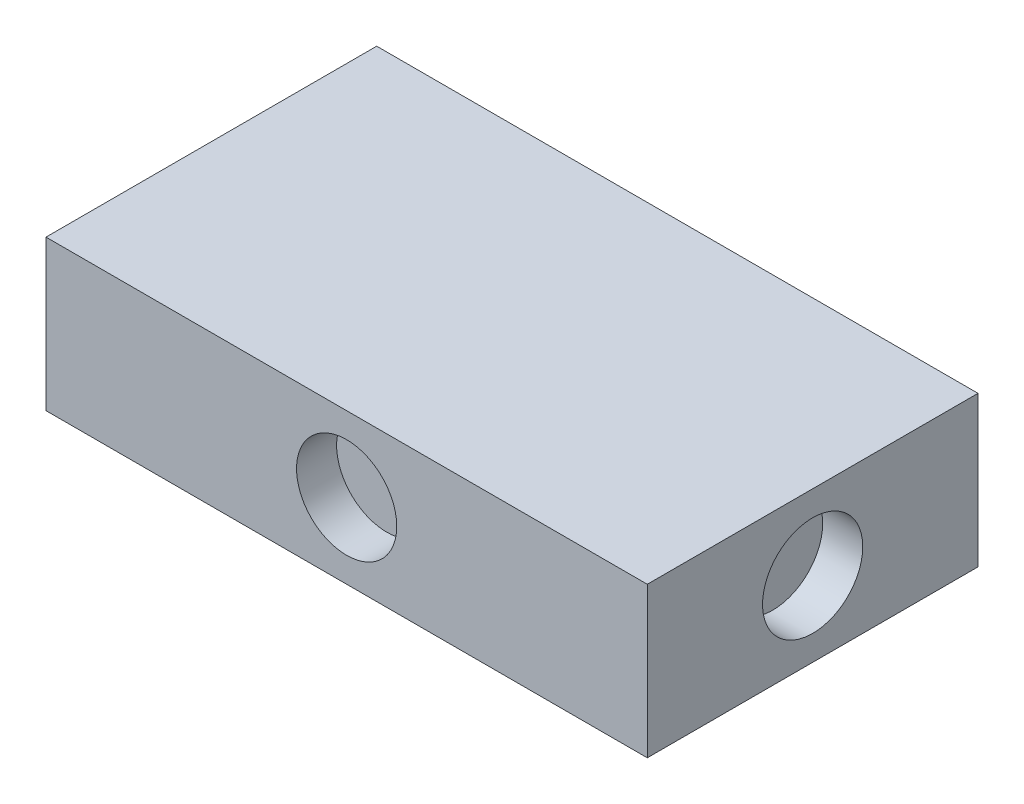
ISO-10303-21;
HEADER;
FILE_DESCRIPTION(('STEP AP214'),'2;1');
FILE_NAME('part.step','',(''),(''),'','','');
FILE_SCHEMA(('AUTOMOTIVE_DESIGN { 1 0 10303 214 1 1 1 1 }'));
ENDSEC;
DATA;
#1=APPLICATION_CONTEXT('core data for automotive mechanical design processes');
#2=APPLICATION_PROTOCOL_DEFINITION('international standard','automotive_design',2000,#1);
#3=PRODUCT_CONTEXT('',#1,'mechanical');
#4=PRODUCT('Part','Part','',(#3));
#5=PRODUCT_RELATED_PRODUCT_CATEGORY('part','',(#4));
#6=PRODUCT_DEFINITION_FORMATION('','',#4);
#7=PRODUCT_DEFINITION_CONTEXT('part definition',#1,'design');
#8=PRODUCT_DEFINITION('design','',#6,#7);
#9=PRODUCT_DEFINITION_SHAPE('','',#8);
#10=(LENGTH_UNIT() NAMED_UNIT(*) SI_UNIT(.MILLI.,.METRE.));
#11=(NAMED_UNIT(*) PLANE_ANGLE_UNIT() SI_UNIT($,.RADIAN.));
#12=(NAMED_UNIT(*) SI_UNIT($,.STERADIAN.) SOLID_ANGLE_UNIT());
#13=UNCERTAINTY_MEASURE_WITH_UNIT(LENGTH_MEASURE(1.E-05),#10,'distance_accuracy_value','');
#14=(GEOMETRIC_REPRESENTATION_CONTEXT(3) GLOBAL_UNCERTAINTY_ASSIGNED_CONTEXT((#13)) GLOBAL_UNIT_ASSIGNED_CONTEXT((#10,
#11,#12)) REPRESENTATION_CONTEXT('',''));
#15=CARTESIAN_POINT('',(0.,0.,0.));
#16=DIRECTION('',(0.,0.,1.));
#17=DIRECTION('',(1.,0.,0.));
#18=AXIS2_PLACEMENT_3D('',#15,#16,#17);
#19=CARTESIAN_POINT('',(38.1,19.05,20.955));
#20=DIRECTION('',(-1.,0.,0.));
#21=DIRECTION('',(0.,0.,1.));
#22=AXIS2_PLACEMENT_3D('',#19,#20,#21);
#23=PLANE('',#22);
#24=CARTESIAN_POINT('',(38.1,9.525,0.));
#25=DIRECTION('',(1.,0.,0.));
#26=DIRECTION('',(0.,0.,-1.));
#27=AXIS2_PLACEMENT_3D('',#24,#25,#26);
#28=CIRCLE('',#27,6.35);
#29=CARTESIAN_POINT('',(38.1,9.525,-6.35));
#30=VERTEX_POINT('',#29);
#31=EDGE_CURVE('E134',#30,#30,#28,.T.);
#32=ORIENTED_EDGE('',*,*,#31,.F.);
#33=EDGE_LOOP('',(#32));
#34=FACE_BOUND('',#33,.T.);
#35=DIRECTION('',(0.,0.,-1.));
#36=VECTOR('',#35,1.);
#37=CARTESIAN_POINT('',(38.1,0.,20.955));
#38=LINE('',#37,#36);
#39=CARTESIAN_POINT('',(38.1,0.,20.955));
#40=VERTEX_POINT('',#39);
#41=CARTESIAN_POINT('',(38.1,0.,-20.955));
#42=VERTEX_POINT('',#41);
#43=EDGE_CURVE('E113',#40,#42,#38,.T.);
#44=ORIENTED_EDGE('',*,*,#43,.T.);
#45=DIRECTION('',(0.,-1.,0.));
#46=VECTOR('',#45,1.);
#47=CARTESIAN_POINT('',(38.1,19.05,-20.955));
#48=LINE('',#47,#46);
#49=CARTESIAN_POINT('',(38.1,19.05,-20.955));
#50=VERTEX_POINT('',#49);
#51=EDGE_CURVE('E11',#50,#42,#48,.T.);
#52=ORIENTED_EDGE('',*,*,#51,.F.);
#53=DIRECTION('',(0.,0.,-1.));
#54=VECTOR('',#53,1.);
#55=CARTESIAN_POINT('',(38.1,19.05,20.955));
#56=LINE('',#55,#54);
#57=CARTESIAN_POINT('',(38.1,19.05,20.955));
#58=VERTEX_POINT('',#57);
#59=EDGE_CURVE('E97',#58,#50,#56,.T.);
#60=ORIENTED_EDGE('',*,*,#59,.F.);
#61=DIRECTION('',(0.,-1.,0.));
#62=VECTOR('',#61,1.);
#63=CARTESIAN_POINT('',(38.1,19.05,20.955));
#64=LINE('',#63,#62);
#65=EDGE_CURVE('E109',#58,#40,#64,.T.);
#66=ORIENTED_EDGE('',*,*,#65,.T.);
#67=EDGE_LOOP('',(#44,#52,#60,#66));
#68=FACE_BOUND('',#67,.T.);
#69=ADVANCED_FACE('F45',(#34,#68),#23,.F.);
#70=CARTESIAN_POINT('',(-38.1,19.05,-20.955));
#71=DIRECTION('',(0.,0.,1.));
#72=DIRECTION('',(1.,0.,0.));
#73=AXIS2_PLACEMENT_3D('',#70,#71,#72);
#74=PLANE('',#73);
#75=CARTESIAN_POINT('',(0.,9.525,-20.955));
#76=DIRECTION('',(0.,0.,-1.));
#77=DIRECTION('',(-1.,0.,0.));
#78=AXIS2_PLACEMENT_3D('',#75,#76,#77);
#79=CIRCLE('',#78,6.35);
#80=CARTESIAN_POINT('',(-6.35,9.525,-20.955));
#81=VERTEX_POINT('',#80);
#82=EDGE_CURVE('E150',#81,#81,#79,.T.);
#83=ORIENTED_EDGE('',*,*,#82,.F.);
#84=EDGE_LOOP('',(#83));
#85=FACE_BOUND('',#84,.T.);
#86=DIRECTION('',(-1.,0.,0.));
#87=VECTOR('',#86,1.);
#88=CARTESIAN_POINT('',(-38.1,0.,-20.955));
#89=LINE('',#88,#87);
#90=CARTESIAN_POINT('',(-38.1,0.,-20.955));
#91=VERTEX_POINT('',#90);
#92=EDGE_CURVE('E102',#42,#91,#89,.T.);
#93=ORIENTED_EDGE('',*,*,#92,.T.);
#94=DIRECTION('',(0.,-1.,0.));
#95=VECTOR('',#94,1.);
#96=CARTESIAN_POINT('',(-38.1,19.05,-20.955));
#97=LINE('',#96,#95);
#98=CARTESIAN_POINT('',(-38.1,19.05,-20.955));
#99=VERTEX_POINT('',#98);
#100=EDGE_CURVE('E54',#99,#91,#97,.T.);
#101=ORIENTED_EDGE('',*,*,#100,.F.);
#102=DIRECTION('',(-1.,0.,0.));
#103=VECTOR('',#102,1.);
#104=CARTESIAN_POINT('',(-38.1,19.05,-20.955));
#105=LINE('',#104,#103);
#106=EDGE_CURVE('E92',#50,#99,#105,.T.);
#107=ORIENTED_EDGE('',*,*,#106,.F.);
#108=ORIENTED_EDGE('',*,*,#51,.T.);
#109=EDGE_LOOP('',(#93,#101,#107,#108));
#110=FACE_BOUND('',#109,.T.);
#111=ADVANCED_FACE('F101',(#85,#110),#74,.F.);
#112=CARTESIAN_POINT('',(-38.1,19.05,20.955));
#113=DIRECTION('',(1.,0.,0.));
#114=DIRECTION('',(0.,0.,-1.));
#115=AXIS2_PLACEMENT_3D('',#112,#113,#114);
#116=PLANE('',#115);
#117=CARTESIAN_POINT('',(-38.1,9.525,0.));
#118=DIRECTION('',(-1.,0.,0.));
#119=DIRECTION('',(0.,0.,1.));
#120=AXIS2_PLACEMENT_3D('',#117,#118,#119);
#121=CIRCLE('',#120,6.35);
#122=CARTESIAN_POINT('',(-38.1,9.525,6.35));
#123=VERTEX_POINT('',#122);
#124=EDGE_CURVE('E158',#123,#123,#121,.T.);
#125=ORIENTED_EDGE('',*,*,#124,.F.);
#126=EDGE_LOOP('',(#125));
#127=FACE_BOUND('',#126,.T.);
#128=DIRECTION('',(0.,0.,1.));
#129=VECTOR('',#128,1.);
#130=CARTESIAN_POINT('',(-38.1,0.,20.955));
#131=LINE('',#130,#129);
#132=CARTESIAN_POINT('',(-38.1,0.,20.955));
#133=VERTEX_POINT('',#132);
#134=EDGE_CURVE('E79',#91,#133,#131,.T.);
#135=ORIENTED_EDGE('',*,*,#134,.T.);
#136=DIRECTION('',(0.,-1.,0.));
#137=VECTOR('',#136,1.);
#138=CARTESIAN_POINT('',(-38.1,19.05,20.955));
#139=LINE('',#138,#137);
#140=CARTESIAN_POINT('',(-38.1,19.05,20.955));
#141=VERTEX_POINT('',#140);
#142=EDGE_CURVE('E104',#141,#133,#139,.T.);
#143=ORIENTED_EDGE('',*,*,#142,.F.);
#144=DIRECTION('',(0.,0.,1.));
#145=VECTOR('',#144,1.);
#146=CARTESIAN_POINT('',(-38.1,19.05,20.955));
#147=LINE('',#146,#145);
#148=EDGE_CURVE('E95',#99,#141,#147,.T.);
#149=ORIENTED_EDGE('',*,*,#148,.F.);
#150=ORIENTED_EDGE('',*,*,#100,.T.);
#151=EDGE_LOOP('',(#135,#143,#149,#150));
#152=FACE_BOUND('',#151,.T.);
#153=ADVANCED_FACE('F105',(#127,#152),#116,.F.);
#154=CARTESIAN_POINT('',(-38.1,19.05,20.955));
#155=DIRECTION('',(0.,0.,-1.));
#156=DIRECTION('',(-1.,0.,0.));
#157=AXIS2_PLACEMENT_3D('',#154,#155,#156);
#158=PLANE('',#157);
#159=CARTESIAN_POINT('',(0.,9.525,20.955));
#160=DIRECTION('',(0.,0.,1.));
#161=DIRECTION('',(1.,0.,0.));
#162=AXIS2_PLACEMENT_3D('',#159,#160,#161);
#163=CIRCLE('',#162,6.35);
#164=CARTESIAN_POINT('',(6.35,9.525,20.955));
#165=VERTEX_POINT('',#164);
#166=EDGE_CURVE('E142',#165,#165,#163,.T.);
#167=ORIENTED_EDGE('',*,*,#166,.F.);
#168=EDGE_LOOP('',(#167));
#169=FACE_BOUND('',#168,.T.);
#170=DIRECTION('',(1.,0.,0.));
#171=VECTOR('',#170,1.);
#172=CARTESIAN_POINT('',(-38.1,0.,20.955));
#173=LINE('',#172,#171);
#174=EDGE_CURVE('E85',#133,#40,#173,.T.);
#175=ORIENTED_EDGE('',*,*,#174,.T.);
#176=ORIENTED_EDGE('',*,*,#65,.F.);
#177=DIRECTION('',(1.,0.,0.));
#178=VECTOR('',#177,1.);
#179=CARTESIAN_POINT('',(-38.1,19.05,20.955));
#180=LINE('',#179,#178);
#181=EDGE_CURVE('E62',#141,#58,#180,.T.);
#182=ORIENTED_EDGE('',*,*,#181,.F.);
#183=ORIENTED_EDGE('',*,*,#142,.T.);
#184=EDGE_LOOP('',(#175,#176,#182,#183));
#185=FACE_BOUND('',#184,.T.);
#186=ADVANCED_FACE('F127',(#169,#185),#158,.F.);
#187=CARTESIAN_POINT('',(0.,19.05,0.));
#188=DIRECTION('',(0.,-1.,0.));
#189=DIRECTION('',(0.,0.,-1.));
#190=AXIS2_PLACEMENT_3D('',#187,#188,#189);
#191=PLANE('',#190);
#192=ORIENTED_EDGE('',*,*,#59,.T.);
#193=ORIENTED_EDGE('',*,*,#106,.T.);
#194=ORIENTED_EDGE('',*,*,#148,.T.);
#195=ORIENTED_EDGE('',*,*,#181,.T.);
#196=EDGE_LOOP('',(#192,#193,#194,#195));
#197=FACE_BOUND('',#196,.T.);
#198=ADVANCED_FACE('F93',(#197),#191,.F.);
#199=CARTESIAN_POINT('',(0.,0.,0.));
#200=DIRECTION('',(0.,-1.,0.));
#201=DIRECTION('',(0.,0.,-1.));
#202=AXIS2_PLACEMENT_3D('',#199,#200,#201);
#203=PLANE('',#202);
#204=ORIENTED_EDGE('',*,*,#43,.F.);
#205=ORIENTED_EDGE('',*,*,#174,.F.);
#206=ORIENTED_EDGE('',*,*,#134,.F.);
#207=ORIENTED_EDGE('',*,*,#92,.F.);
#208=EDGE_LOOP('',(#204,#205,#206,#207));
#209=FACE_BOUND('',#208,.T.);
#210=ADVANCED_FACE('F130',(#209),#203,.T.);
#211=CARTESIAN_POINT('',(33.02,9.525,0.));
#212=DIRECTION('',(1.,0.,0.));
#213=DIRECTION('',(0.,0.,-1.));
#214=AXIS2_PLACEMENT_3D('',#211,#212,#213);
#215=CYLINDRICAL_SURFACE('',#214,6.35);
#216=CARTESIAN_POINT('',(33.02,9.525,0.));
#217=DIRECTION('',(1.,0.,0.));
#218=DIRECTION('',(0.,0.,-1.));
#219=AXIS2_PLACEMENT_3D('',#216,#217,#218);
#220=CIRCLE('',#219,6.35);
#221=CARTESIAN_POINT('',(33.02,9.525,-6.35));
#222=VERTEX_POINT('',#221);
#223=EDGE_CURVE('E117',#222,#222,#220,.T.);
#224=ORIENTED_EDGE('',*,*,#223,.F.);
#225=EDGE_LOOP('',(#224));
#226=FACE_BOUND('',#225,.T.);
#227=ORIENTED_EDGE('',*,*,#31,.T.);
#228=EDGE_LOOP('',(#227));
#229=FACE_BOUND('',#228,.T.);
#230=ADVANCED_FACE('F193',(#226,#229),#215,.F.);
#231=CARTESIAN_POINT('',(33.02,9.525,0.));
#232=DIRECTION('',(1.,0.,0.));
#233=DIRECTION('',(0.,0.,-1.));
#234=AXIS2_PLACEMENT_3D('',#231,#232,#233);
#235=PLANE('',#234);
#236=ORIENTED_EDGE('',*,*,#223,.T.);
#237=EDGE_LOOP('',(#236));
#238=FACE_BOUND('',#237,.T.);
#239=ADVANCED_FACE('F194',(#238),#235,.T.);
#240=CARTESIAN_POINT('',(0.,9.525,15.875));
#241=DIRECTION('',(0.,0.,1.));
#242=DIRECTION('',(1.,0.,0.));
#243=AXIS2_PLACEMENT_3D('',#240,#241,#242);
#244=CYLINDRICAL_SURFACE('',#243,6.35);
#245=CARTESIAN_POINT('',(0.,9.525,15.875));
#246=DIRECTION('',(0.,0.,1.));
#247=DIRECTION('',(1.,0.,0.));
#248=AXIS2_PLACEMENT_3D('',#245,#246,#247);
#249=CIRCLE('',#248,6.35);
#250=CARTESIAN_POINT('',(6.35,9.525,15.875));
#251=VERTEX_POINT('',#250);
#252=EDGE_CURVE('E138',#251,#251,#249,.T.);
#253=ORIENTED_EDGE('',*,*,#252,.F.);
#254=EDGE_LOOP('',(#253));
#255=FACE_BOUND('',#254,.T.);
#256=ORIENTED_EDGE('',*,*,#166,.T.);
#257=EDGE_LOOP('',(#256));
#258=FACE_BOUND('',#257,.T.);
#259=ADVANCED_FACE('F200',(#255,#258),#244,.F.);
#260=CARTESIAN_POINT('',(0.,9.525,15.875));
#261=DIRECTION('',(0.,0.,1.));
#262=DIRECTION('',(1.,0.,0.));
#263=AXIS2_PLACEMENT_3D('',#260,#261,#262);
#264=PLANE('',#263);
#265=ORIENTED_EDGE('',*,*,#252,.T.);
#266=EDGE_LOOP('',(#265));
#267=FACE_BOUND('',#266,.T.);
#268=ADVANCED_FACE('F236',(#267),#264,.T.);
#269=CARTESIAN_POINT('',(0.,9.525,-15.875));
#270=DIRECTION('',(0.,0.,-1.));
#271=DIRECTION('',(-1.,0.,0.));
#272=AXIS2_PLACEMENT_3D('',#269,#270,#271);
#273=CYLINDRICAL_SURFACE('',#272,6.35);
#274=CARTESIAN_POINT('',(0.,9.525,-15.875));
#275=DIRECTION('',(0.,0.,-1.));
#276=DIRECTION('',(-1.,0.,0.));
#277=AXIS2_PLACEMENT_3D('',#274,#275,#276);
#278=CIRCLE('',#277,6.35);
#279=CARTESIAN_POINT('',(-6.35,9.525,-15.875));
#280=VERTEX_POINT('',#279);
#281=EDGE_CURVE('E146',#280,#280,#278,.T.);
#282=ORIENTED_EDGE('',*,*,#281,.F.);
#283=EDGE_LOOP('',(#282));
#284=FACE_BOUND('',#283,.T.);
#285=ORIENTED_EDGE('',*,*,#82,.T.);
#286=EDGE_LOOP('',(#285));
#287=FACE_BOUND('',#286,.T.);
#288=ADVANCED_FACE('F245',(#284,#287),#273,.F.);
#289=CARTESIAN_POINT('',(0.,9.525,-15.875));
#290=DIRECTION('',(0.,0.,-1.));
#291=DIRECTION('',(-1.,0.,0.));
#292=AXIS2_PLACEMENT_3D('',#289,#290,#291);
#293=PLANE('',#292);
#294=ORIENTED_EDGE('',*,*,#281,.T.);
#295=EDGE_LOOP('',(#294));
#296=FACE_BOUND('',#295,.T.);
#297=ADVANCED_FACE('F171',(#296),#293,.T.);
#298=CARTESIAN_POINT('',(-33.02,9.525,0.));
#299=DIRECTION('',(-1.,0.,0.));
#300=DIRECTION('',(0.,0.,1.));
#301=AXIS2_PLACEMENT_3D('',#298,#299,#300);
#302=CYLINDRICAL_SURFACE('',#301,6.35);
#303=CARTESIAN_POINT('',(-33.02,9.525,0.));
#304=DIRECTION('',(-1.,0.,0.));
#305=DIRECTION('',(0.,0.,1.));
#306=AXIS2_PLACEMENT_3D('',#303,#304,#305);
#307=CIRCLE('',#306,6.35);
#308=CARTESIAN_POINT('',(-33.02,9.525,6.35));
#309=VERTEX_POINT('',#308);
#310=EDGE_CURVE('E154',#309,#309,#307,.T.);
#311=ORIENTED_EDGE('',*,*,#310,.F.);
#312=EDGE_LOOP('',(#311));
#313=FACE_BOUND('',#312,.T.);
#314=ORIENTED_EDGE('',*,*,#124,.T.);
#315=EDGE_LOOP('',(#314));
#316=FACE_BOUND('',#315,.T.);
#317=ADVANCED_FACE('F168',(#313,#316),#302,.F.);
#318=CARTESIAN_POINT('',(-33.02,9.525,0.));
#319=DIRECTION('',(-1.,0.,0.));
#320=DIRECTION('',(0.,0.,1.));
#321=AXIS2_PLACEMENT_3D('',#318,#319,#320);
#322=PLANE('',#321);
#323=ORIENTED_EDGE('',*,*,#310,.T.);
#324=EDGE_LOOP('',(#323));
#325=FACE_BOUND('',#324,.T.);
#326=ADVANCED_FACE('F166',(#325),#322,.T.);
#327=CLOSED_SHELL('',(#69,#111,#153,#186,#198,#210,#230,#239,#259,#268,#288,#297,#317,#326));
#328=MANIFOLD_SOLID_BREP('B2',#327);
#329=ADVANCED_BREP_SHAPE_REPRESENTATION('',(#18,#328),#14);
#330=SHAPE_DEFINITION_REPRESENTATION(#9,#329);
ENDSEC;
END-ISO-10303-21;
